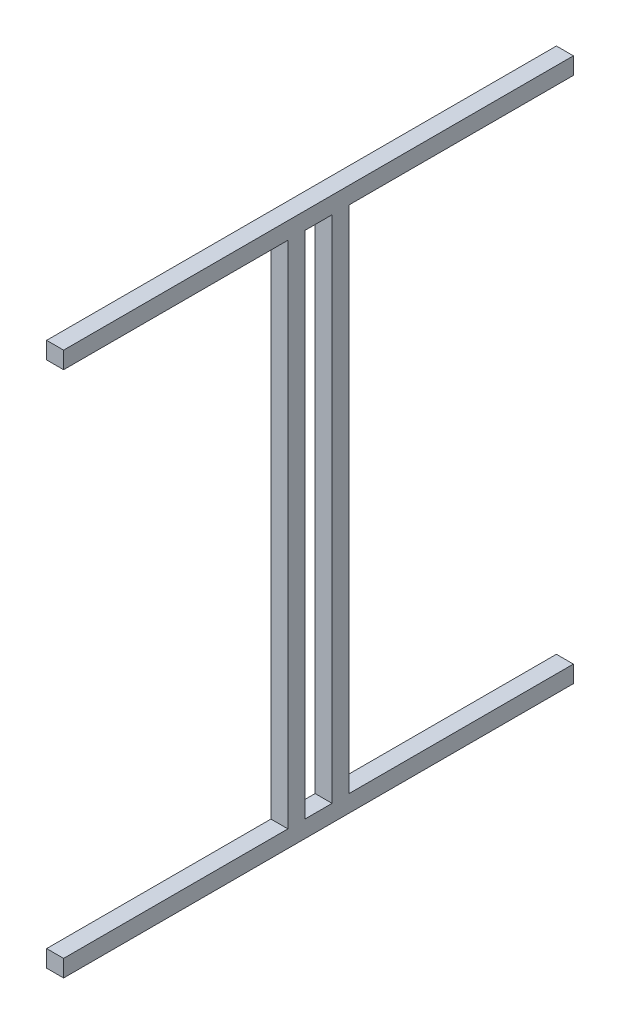
ISO-10303-21;
HEADER;
FILE_DESCRIPTION(('STEP AP214'),'2;1');
FILE_NAME('part.step','',(''),(''),'','','');
FILE_SCHEMA(('AUTOMOTIVE_DESIGN { 1 0 10303 214 1 1 1 1 }'));
ENDSEC;
DATA;
#1=APPLICATION_CONTEXT('core data for automotive mechanical design processes');
#2=APPLICATION_PROTOCOL_DEFINITION('international standard','automotive_design',2000,#1);
#3=PRODUCT_CONTEXT('',#1,'mechanical');
#4=PRODUCT('Part','Part','',(#3));
#5=PRODUCT_RELATED_PRODUCT_CATEGORY('part','',(#4));
#6=PRODUCT_DEFINITION_FORMATION('','',#4);
#7=PRODUCT_DEFINITION_CONTEXT('part definition',#1,'design');
#8=PRODUCT_DEFINITION('design','',#6,#7);
#9=PRODUCT_DEFINITION_SHAPE('','',#8);
#10=(LENGTH_UNIT() NAMED_UNIT(*) SI_UNIT(.MILLI.,.METRE.));
#11=(NAMED_UNIT(*) PLANE_ANGLE_UNIT() SI_UNIT($,.RADIAN.));
#12=(NAMED_UNIT(*) SI_UNIT($,.STERADIAN.) SOLID_ANGLE_UNIT());
#13=UNCERTAINTY_MEASURE_WITH_UNIT(LENGTH_MEASURE(1.E-05),#10,'distance_accuracy_value','');
#14=(GEOMETRIC_REPRESENTATION_CONTEXT(3) GLOBAL_UNCERTAINTY_ASSIGNED_CONTEXT((#13)) GLOBAL_UNIT_ASSIGNED_CONTEXT((#10,
#11,#12)) REPRESENTATION_CONTEXT('',''));
#15=CARTESIAN_POINT('',(0.,0.,0.));
#16=DIRECTION('',(0.,0.,1.));
#17=DIRECTION('',(1.,0.,0.));
#18=AXIS2_PLACEMENT_3D('',#15,#16,#17);
#19=CARTESIAN_POINT('',(20.,0.,0.));
#20=DIRECTION('',(0.,0.,-1.));
#21=DIRECTION('',(-1.,0.,0.));
#22=AXIS2_PLACEMENT_3D('',#19,#20,#21);
#23=PLANE('',#22);
#24=DIRECTION('',(0.,-1.,0.));
#25=VECTOR('',#24,1.);
#26=CARTESIAN_POINT('',(0.,0.,0.));
#27=LINE('',#26,#25);
#28=CARTESIAN_POINT('',(0.,-500.,0.));
#29=VERTEX_POINT('',#28);
#30=CARTESIAN_POINT('',(0.,-520.,0.));
#31=VERTEX_POINT('',#30);
#32=EDGE_CURVE('E265',#29,#31,#27,.T.);
#33=ORIENTED_EDGE('',*,*,#32,.F.);
#34=DIRECTION('',(-1.,0.,0.));
#35=VECTOR('',#34,1.);
#36=CARTESIAN_POINT('',(20.,-500.,0.));
#37=LINE('',#36,#35);
#38=CARTESIAN_POINT('',(20.,-500.,0.));
#39=VERTEX_POINT('',#38);
#40=EDGE_CURVE('E93',#39,#29,#37,.T.);
#41=ORIENTED_EDGE('',*,*,#40,.F.);
#42=DIRECTION('',(0.,-1.,0.));
#43=VECTOR('',#42,1.);
#44=CARTESIAN_POINT('',(20.,0.,0.));
#45=LINE('',#44,#43);
#46=CARTESIAN_POINT('',(20.,-520.,0.));
#47=VERTEX_POINT('',#46);
#48=EDGE_CURVE('E286',#39,#47,#45,.T.);
#49=ORIENTED_EDGE('',*,*,#48,.T.);
#50=DIRECTION('',(-1.,0.,0.));
#51=VECTOR('',#50,1.);
#52=CARTESIAN_POINT('',(20.,-520.,0.));
#53=LINE('',#52,#51);
#54=EDGE_CURVE('E12',#47,#31,#53,.T.);
#55=ORIENTED_EDGE('',*,*,#54,.T.);
#56=EDGE_LOOP('',(#33,#41,#49,#55));
#57=FACE_BOUND('',#56,.T.);
#58=ADVANCED_FACE('F83',(#57),#23,.T.);
#59=CARTESIAN_POINT('',(20.,-500.,0.));
#60=DIRECTION('',(0.,-1.,0.));
#61=DIRECTION('',(0.,0.,-1.));
#62=AXIS2_PLACEMENT_3D('',#59,#60,#61);
#63=PLANE('',#62);
#64=DIRECTION('',(0.,0.,1.));
#65=VECTOR('',#64,1.);
#66=CARTESIAN_POINT('',(0.,-500.,0.));
#67=LINE('',#66,#65);
#68=CARTESIAN_POINT('',(0.,-500.,600.));
#69=VERTEX_POINT('',#68);
#70=EDGE_CURVE('E263',#29,#69,#67,.T.);
#71=ORIENTED_EDGE('',*,*,#70,.T.);
#72=DIRECTION('',(-1.,0.,0.));
#73=VECTOR('',#72,1.);
#74=CARTESIAN_POINT('',(20.,-500.,600.));
#75=LINE('',#74,#73);
#76=CARTESIAN_POINT('',(20.,-500.,600.));
#77=VERTEX_POINT('',#76);
#78=EDGE_CURVE('E226',#77,#69,#75,.T.);
#79=ORIENTED_EDGE('',*,*,#78,.F.);
#80=DIRECTION('',(0.,0.,1.));
#81=VECTOR('',#80,1.);
#82=CARTESIAN_POINT('',(20.,-500.,0.));
#83=LINE('',#82,#81);
#84=EDGE_CURVE('E283',#39,#77,#83,.T.);
#85=ORIENTED_EDGE('',*,*,#84,.F.);
#86=ORIENTED_EDGE('',*,*,#40,.T.);
#87=EDGE_LOOP('',(#71,#79,#85,#86));
#88=FACE_BOUND('',#87,.T.);
#89=ADVANCED_FACE('F353',(#88),#63,.F.);
#90=CARTESIAN_POINT('',(20.,0.,600.));
#91=DIRECTION('',(0.,0.,-1.));
#92=DIRECTION('',(-1.,0.,0.));
#93=AXIS2_PLACEMENT_3D('',#90,#91,#92);
#94=PLANE('',#93);
#95=DIRECTION('',(0.,-1.,0.));
#96=VECTOR('',#95,1.);
#97=CARTESIAN_POINT('',(0.,0.,600.));
#98=LINE('',#97,#96);
#99=CARTESIAN_POINT('',(0.,-520.,600.));
#100=VERTEX_POINT('',#99);
#101=EDGE_CURVE('E260',#69,#100,#98,.T.);
#102=ORIENTED_EDGE('',*,*,#101,.T.);
#103=DIRECTION('',(-1.,0.,0.));
#104=VECTOR('',#103,1.);
#105=CARTESIAN_POINT('',(20.,-520.,600.));
#106=LINE('',#105,#104);
#107=CARTESIAN_POINT('',(20.,-520.,600.));
#108=VERTEX_POINT('',#107);
#109=EDGE_CURVE('E229',#108,#100,#106,.T.);
#110=ORIENTED_EDGE('',*,*,#109,.F.);
#111=DIRECTION('',(0.,-1.,0.));
#112=VECTOR('',#111,1.);
#113=CARTESIAN_POINT('',(20.,0.,600.));
#114=LINE('',#113,#112);
#115=EDGE_CURVE('E280',#77,#108,#114,.T.);
#116=ORIENTED_EDGE('',*,*,#115,.F.);
#117=ORIENTED_EDGE('',*,*,#78,.T.);
#118=EDGE_LOOP('',(#102,#110,#116,#117));
#119=FACE_BOUND('',#118,.T.);
#120=ADVANCED_FACE('F359',(#119),#94,.F.);
#121=CARTESIAN_POINT('',(20.,-520.,0.));
#122=DIRECTION('',(0.,-1.,0.));
#123=DIRECTION('',(0.,0.,-1.));
#124=AXIS2_PLACEMENT_3D('',#121,#122,#123);
#125=PLANE('',#124);
#126=DIRECTION('',(0.,0.,1.));
#127=VECTOR('',#126,1.);
#128=CARTESIAN_POINT('',(0.,-520.,0.));
#129=LINE('',#128,#127);
#130=CARTESIAN_POINT('',(0.,-520.,336.));
#131=VERTEX_POINT('',#130);
#132=EDGE_CURVE('E259',#131,#100,#129,.T.);
#133=ORIENTED_EDGE('',*,*,#132,.F.);
#134=DIRECTION('',(-1.,0.,0.));
#135=VECTOR('',#134,1.);
#136=CARTESIAN_POINT('',(20.,-520.,336.));
#137=LINE('',#136,#135);
#138=CARTESIAN_POINT('',(20.,-520.,336.));
#139=VERTEX_POINT('',#138);
#140=EDGE_CURVE('E231',#139,#131,#137,.T.);
#141=ORIENTED_EDGE('',*,*,#140,.F.);
#142=DIRECTION('',(0.,0.,1.));
#143=VECTOR('',#142,1.);
#144=CARTESIAN_POINT('',(20.,-520.,0.));
#145=LINE('',#144,#143);
#146=EDGE_CURVE('E279',#139,#108,#145,.T.);
#147=ORIENTED_EDGE('',*,*,#146,.T.);
#148=ORIENTED_EDGE('',*,*,#109,.T.);
#149=EDGE_LOOP('',(#133,#141,#147,#148));
#150=FACE_BOUND('',#149,.T.);
#151=ADVANCED_FACE('F299',(#150),#125,.T.);
#152=CARTESIAN_POINT('',(20.,0.,336.));
#153=DIRECTION('',(0.,0.,-1.));
#154=DIRECTION('',(0.,1.,0.));
#155=AXIS2_PLACEMENT_3D('',#152,#153,#154);
#156=PLANE('',#155);
#157=DIRECTION('',(0.,-1.,0.));
#158=VECTOR('',#157,1.);
#159=CARTESIAN_POINT('',(0.,0.,336.));
#160=LINE('',#159,#158);
#161=CARTESIAN_POINT('',(0.,-1120.,336.));
#162=VERTEX_POINT('',#161);
#163=EDGE_CURVE('E256',#131,#162,#160,.T.);
#164=ORIENTED_EDGE('',*,*,#163,.T.);
#165=DIRECTION('',(-1.,0.,0.));
#166=VECTOR('',#165,1.);
#167=CARTESIAN_POINT('',(20.,-1120.,336.));
#168=LINE('',#167,#166);
#169=CARTESIAN_POINT('',(20.,-1120.,336.));
#170=VERTEX_POINT('',#169);
#171=EDGE_CURVE('E233',#170,#162,#168,.T.);
#172=ORIENTED_EDGE('',*,*,#171,.F.);
#173=DIRECTION('',(0.,-1.,0.));
#174=VECTOR('',#173,1.);
#175=CARTESIAN_POINT('',(20.,0.,336.));
#176=LINE('',#175,#174);
#177=EDGE_CURVE('E277',#139,#170,#176,.T.);
#178=ORIENTED_EDGE('',*,*,#177,.F.);
#179=ORIENTED_EDGE('',*,*,#140,.T.);
#180=EDGE_LOOP('',(#164,#172,#178,#179));
#181=FACE_BOUND('',#180,.T.);
#182=ADVANCED_FACE('F342',(#181),#156,.F.);
#183=CARTESIAN_POINT('',(20.,0.,316.));
#184=DIRECTION('',(0.,0.,-1.));
#185=DIRECTION('',(-1.,0.,0.));
#186=AXIS2_PLACEMENT_3D('',#183,#184,#185);
#187=PLANE('',#186);
#188=DIRECTION('',(0.,-1.,0.));
#189=VECTOR('',#188,1.);
#190=CARTESIAN_POINT('',(0.,0.,316.));
#191=LINE('',#190,#189);
#192=CARTESIAN_POINT('',(0.,-520.,316.));
#193=VERTEX_POINT('',#192);
#194=CARTESIAN_POINT('',(0.,-1120.,316.));
#195=VERTEX_POINT('',#194);
#196=EDGE_CURVE('E253',#193,#195,#191,.T.);
#197=ORIENTED_EDGE('',*,*,#196,.F.);
#198=DIRECTION('',(-1.,0.,0.));
#199=VECTOR('',#198,1.);
#200=CARTESIAN_POINT('',(20.,-520.,316.));
#201=LINE('',#200,#199);
#202=CARTESIAN_POINT('',(20.,-520.,316.));
#203=VERTEX_POINT('',#202);
#204=EDGE_CURVE('E237',#203,#193,#201,.T.);
#205=ORIENTED_EDGE('',*,*,#204,.F.);
#206=DIRECTION('',(0.,-1.,0.));
#207=VECTOR('',#206,1.);
#208=CARTESIAN_POINT('',(20.,0.,316.));
#209=LINE('',#208,#207);
#210=CARTESIAN_POINT('',(20.,-1120.,316.));
#211=VERTEX_POINT('',#210);
#212=EDGE_CURVE('E274',#203,#211,#209,.T.);
#213=ORIENTED_EDGE('',*,*,#212,.T.);
#214=DIRECTION('',(-1.,0.,0.));
#215=VECTOR('',#214,1.);
#216=CARTESIAN_POINT('',(20.,-1120.,316.));
#217=LINE('',#216,#215);
#218=EDGE_CURVE('E235',#211,#195,#217,.T.);
#219=ORIENTED_EDGE('',*,*,#218,.T.);
#220=EDGE_LOOP('',(#197,#205,#213,#219));
#221=FACE_BOUND('',#220,.T.);
#222=ADVANCED_FACE('F340',(#221),#187,.T.);
#223=CARTESIAN_POINT('',(0.,-520.,284.));
#224=VERTEX_POINT('',#223);
#225=EDGE_CURVE('E252',#224,#193,#129,.T.);
#226=ORIENTED_EDGE('',*,*,#225,.F.);
#227=DIRECTION('',(-1.,0.,0.));
#228=VECTOR('',#227,1.);
#229=CARTESIAN_POINT('',(20.,-520.,284.));
#230=LINE('',#229,#228);
#231=CARTESIAN_POINT('',(20.,-520.,284.));
#232=VERTEX_POINT('',#231);
#233=EDGE_CURVE('E239',#232,#224,#230,.T.);
#234=ORIENTED_EDGE('',*,*,#233,.F.);
#235=EDGE_CURVE('E273',#232,#203,#145,.T.);
#236=ORIENTED_EDGE('',*,*,#235,.T.);
#237=ORIENTED_EDGE('',*,*,#204,.T.);
#238=EDGE_LOOP('',(#226,#234,#236,#237));
#239=FACE_BOUND('',#238,.T.);
#240=ADVANCED_FACE('F336',(#239),#125,.T.);
#241=CARTESIAN_POINT('',(20.,0.,284.));
#242=DIRECTION('',(0.,0.,-1.));
#243=DIRECTION('',(-1.,0.,0.));
#244=AXIS2_PLACEMENT_3D('',#241,#242,#243);
#245=PLANE('',#244);
#246=DIRECTION('',(0.,-1.,0.));
#247=VECTOR('',#246,1.);
#248=CARTESIAN_POINT('',(0.,0.,284.));
#249=LINE('',#248,#247);
#250=CARTESIAN_POINT('',(0.,-1120.,284.));
#251=VERTEX_POINT('',#250);
#252=EDGE_CURVE('E249',#224,#251,#249,.T.);
#253=ORIENTED_EDGE('',*,*,#252,.T.);
#254=DIRECTION('',(-1.,0.,0.));
#255=VECTOR('',#254,1.);
#256=CARTESIAN_POINT('',(20.,-1120.,284.));
#257=LINE('',#256,#255);
#258=CARTESIAN_POINT('',(20.,-1120.,284.));
#259=VERTEX_POINT('',#258);
#260=EDGE_CURVE('E241',#259,#251,#257,.T.);
#261=ORIENTED_EDGE('',*,*,#260,.F.);
#262=DIRECTION('',(0.,-1.,0.));
#263=VECTOR('',#262,1.);
#264=CARTESIAN_POINT('',(20.,0.,284.));
#265=LINE('',#264,#263);
#266=EDGE_CURVE('E270',#232,#259,#265,.T.);
#267=ORIENTED_EDGE('',*,*,#266,.F.);
#268=ORIENTED_EDGE('',*,*,#233,.T.);
#269=EDGE_LOOP('',(#253,#261,#267,#268));
#270=FACE_BOUND('',#269,.T.);
#271=ADVANCED_FACE('F326',(#270),#245,.F.);
#272=CARTESIAN_POINT('',(20.,0.,264.));
#273=DIRECTION('',(0.,0.,-1.));
#274=DIRECTION('',(0.,1.,0.));
#275=AXIS2_PLACEMENT_3D('',#272,#273,#274);
#276=PLANE('',#275);
#277=DIRECTION('',(0.,-1.,0.));
#278=VECTOR('',#277,1.);
#279=CARTESIAN_POINT('',(0.,0.,264.));
#280=LINE('',#279,#278);
#281=CARTESIAN_POINT('',(0.,-520.,264.));
#282=VERTEX_POINT('',#281);
#283=CARTESIAN_POINT('',(0.,-1120.,264.));
#284=VERTEX_POINT('',#283);
#285=EDGE_CURVE('E193',#282,#284,#280,.T.);
#286=ORIENTED_EDGE('',*,*,#285,.F.);
#287=DIRECTION('',(-1.,0.,0.));
#288=VECTOR('',#287,1.);
#289=CARTESIAN_POINT('',(20.,-520.,264.));
#290=LINE('',#289,#288);
#291=CARTESIAN_POINT('',(20.,-520.,264.));
#292=VERTEX_POINT('',#291);
#293=EDGE_CURVE('E102',#292,#282,#290,.T.);
#294=ORIENTED_EDGE('',*,*,#293,.F.);
#295=DIRECTION('',(0.,-1.,0.));
#296=VECTOR('',#295,1.);
#297=CARTESIAN_POINT('',(20.,0.,264.));
#298=LINE('',#297,#296);
#299=CARTESIAN_POINT('',(20.,-1120.,264.));
#300=VERTEX_POINT('',#299);
#301=EDGE_CURVE('E246',#292,#300,#298,.T.);
#302=ORIENTED_EDGE('',*,*,#301,.T.);
#303=DIRECTION('',(-1.,0.,0.));
#304=VECTOR('',#303,1.);
#305=CARTESIAN_POINT('',(20.,-1120.,264.));
#306=LINE('',#305,#304);
#307=EDGE_CURVE('E243',#300,#284,#306,.T.);
#308=ORIENTED_EDGE('',*,*,#307,.T.);
#309=EDGE_LOOP('',(#286,#294,#302,#308));
#310=FACE_BOUND('',#309,.T.);
#311=ADVANCED_FACE('F390',(#310),#276,.T.);
#312=EDGE_CURVE('E183',#31,#282,#129,.T.);
#313=ORIENTED_EDGE('',*,*,#312,.F.);
#314=ORIENTED_EDGE('',*,*,#54,.F.);
#315=EDGE_CURVE('E248',#47,#292,#145,.T.);
#316=ORIENTED_EDGE('',*,*,#315,.T.);
#317=ORIENTED_EDGE('',*,*,#293,.T.);
#318=EDGE_LOOP('',(#313,#314,#316,#317));
#319=FACE_BOUND('',#318,.T.);
#320=ADVANCED_FACE('F349',(#319),#125,.T.);
#321=CARTESIAN_POINT('',(0.,0.,0.));
#322=DIRECTION('',(1.,0.,0.));
#323=DIRECTION('',(0.,0.,-1.));
#324=AXIS2_PLACEMENT_3D('',#321,#322,#323);
#325=PLANE('',#324);
#326=DIRECTION('',(0.,0.,1.));
#327=VECTOR('',#326,1.);
#328=CARTESIAN_POINT('',(0.,-1120.,-6.54926439620986E-12));
#329=LINE('',#328,#327);
#330=CARTESIAN_POINT('',(0.,-1120.,599.999999999994));
#331=VERTEX_POINT('',#330);
#332=EDGE_CURVE('E166',#162,#331,#329,.T.);
#333=ORIENTED_EDGE('',*,*,#332,.F.);
#334=ORIENTED_EDGE('',*,*,#163,.F.);
#335=ORIENTED_EDGE('',*,*,#132,.T.);
#336=ORIENTED_EDGE('',*,*,#101,.F.);
#337=ORIENTED_EDGE('',*,*,#70,.F.);
#338=ORIENTED_EDGE('',*,*,#32,.T.);
#339=ORIENTED_EDGE('',*,*,#312,.T.);
#340=ORIENTED_EDGE('',*,*,#285,.T.);
#341=CARTESIAN_POINT('',(0.,-1120.,-6.54926439620986E-12));
#342=VERTEX_POINT('',#341);
#343=EDGE_CURVE('E175',#342,#284,#329,.T.);
#344=ORIENTED_EDGE('',*,*,#343,.F.);
#345=DIRECTION('',(0.,-1.,0.));
#346=VECTOR('',#345,1.);
#347=CARTESIAN_POINT('',(0.,-1120.,-6.54926439620986E-12));
#348=LINE('',#347,#346);
#349=CARTESIAN_POINT('',(0.,-1140.,-6.54926439620986E-12));
#350=VERTEX_POINT('',#349);
#351=EDGE_CURVE('E191',#342,#350,#348,.T.);
#352=ORIENTED_EDGE('',*,*,#351,.T.);
#353=DIRECTION('',(0.,0.,1.));
#354=VECTOR('',#353,1.);
#355=CARTESIAN_POINT('',(0.,-1140.,-6.54926439620986E-12));
#356=LINE('',#355,#354);
#357=CARTESIAN_POINT('',(0.,-1140.,599.999999999994));
#358=VERTEX_POINT('',#357);
#359=EDGE_CURVE('E198',#350,#358,#356,.T.);
#360=ORIENTED_EDGE('',*,*,#359,.T.);
#361=DIRECTION('',(0.,-1.,0.));
#362=VECTOR('',#361,1.);
#363=CARTESIAN_POINT('',(0.,-1120.,599.999999999994));
#364=LINE('',#363,#362);
#365=EDGE_CURVE('E200',#331,#358,#364,.T.);
#366=ORIENTED_EDGE('',*,*,#365,.F.);
#367=EDGE_LOOP('',(#333,#334,#335,#336,#337,#338,#339,#340,#344,#352,#360,#366));
#368=FACE_BOUND('',#367,.T.);
#369=ORIENTED_EDGE('',*,*,#196,.T.);
#370=EDGE_CURVE('E195',#251,#195,#329,.T.);
#371=ORIENTED_EDGE('',*,*,#370,.F.);
#372=ORIENTED_EDGE('',*,*,#252,.F.);
#373=ORIENTED_EDGE('',*,*,#225,.T.);
#374=EDGE_LOOP('',(#369,#371,#372,#373));
#375=FACE_BOUND('',#374,.T.);
#376=ADVANCED_FACE('F188',(#368,#375),#325,.F.);
#377=CARTESIAN_POINT('',(20.,0.,0.));
#378=DIRECTION('',(1.,0.,0.));
#379=DIRECTION('',(0.,0.,-1.));
#380=AXIS2_PLACEMENT_3D('',#377,#378,#379);
#381=PLANE('',#380);
#382=ORIENTED_EDGE('',*,*,#177,.T.);
#383=DIRECTION('',(0.,0.,1.));
#384=VECTOR('',#383,1.);
#385=CARTESIAN_POINT('',(20.,-1120.,-6.54926439620986E-12));
#386=LINE('',#385,#384);
#387=CARTESIAN_POINT('',(20.,-1120.,599.999999999994));
#388=VERTEX_POINT('',#387);
#389=EDGE_CURVE('E212',#170,#388,#386,.T.);
#390=ORIENTED_EDGE('',*,*,#389,.T.);
#391=DIRECTION('',(0.,-1.,0.));
#392=VECTOR('',#391,1.);
#393=CARTESIAN_POINT('',(20.,-1120.,599.999999999994));
#394=LINE('',#393,#392);
#395=CARTESIAN_POINT('',(20.,-1140.,599.999999999994));
#396=VERTEX_POINT('',#395);
#397=EDGE_CURVE('E216',#388,#396,#394,.T.);
#398=ORIENTED_EDGE('',*,*,#397,.T.);
#399=DIRECTION('',(0.,0.,1.));
#400=VECTOR('',#399,1.);
#401=CARTESIAN_POINT('',(20.,-1140.,-6.54926439620986E-12));
#402=LINE('',#401,#400);
#403=CARTESIAN_POINT('',(20.,-1140.,-6.54926439620986E-12));
#404=VERTEX_POINT('',#403);
#405=EDGE_CURVE('E219',#404,#396,#402,.T.);
#406=ORIENTED_EDGE('',*,*,#405,.F.);
#407=DIRECTION('',(0.,-1.,0.));
#408=VECTOR('',#407,1.);
#409=CARTESIAN_POINT('',(20.,-1120.,-6.54926439620986E-12));
#410=LINE('',#409,#408);
#411=CARTESIAN_POINT('',(20.,-1120.,-6.54926439620986E-12));
#412=VERTEX_POINT('',#411);
#413=EDGE_CURVE('E194',#412,#404,#410,.T.);
#414=ORIENTED_EDGE('',*,*,#413,.F.);
#415=EDGE_CURVE('E178',#412,#300,#386,.T.);
#416=ORIENTED_EDGE('',*,*,#415,.T.);
#417=ORIENTED_EDGE('',*,*,#301,.F.);
#418=ORIENTED_EDGE('',*,*,#315,.F.);
#419=ORIENTED_EDGE('',*,*,#48,.F.);
#420=ORIENTED_EDGE('',*,*,#84,.T.);
#421=ORIENTED_EDGE('',*,*,#115,.T.);
#422=ORIENTED_EDGE('',*,*,#146,.F.);
#423=EDGE_LOOP('',(#382,#390,#398,#406,#414,#416,#417,#418,#419,#420,#421,#422));
#424=FACE_BOUND('',#423,.T.);
#425=EDGE_CURVE('E211',#259,#211,#386,.T.);
#426=ORIENTED_EDGE('',*,*,#425,.T.);
#427=ORIENTED_EDGE('',*,*,#212,.F.);
#428=ORIENTED_EDGE('',*,*,#235,.F.);
#429=ORIENTED_EDGE('',*,*,#266,.T.);
#430=EDGE_LOOP('',(#426,#427,#428,#429));
#431=FACE_BOUND('',#430,.T.);
#432=ADVANCED_FACE('F305',(#424,#431),#381,.T.);
#433=CARTESIAN_POINT('',(20.,-1120.,-6.54926439620986E-12));
#434=DIRECTION('',(0.,-1.,0.));
#435=DIRECTION('',(0.,0.,-1.));
#436=AXIS2_PLACEMENT_3D('',#433,#434,#435);
#437=PLANE('',#436);
#438=ORIENTED_EDGE('',*,*,#307,.F.);
#439=ORIENTED_EDGE('',*,*,#415,.F.);
#440=DIRECTION('',(-1.,0.,0.));
#441=VECTOR('',#440,1.);
#442=CARTESIAN_POINT('',(20.,-1120.,-6.54926439620986E-12));
#443=LINE('',#442,#441);
#444=EDGE_CURVE('E172',#412,#342,#443,.T.);
#445=ORIENTED_EDGE('',*,*,#444,.T.);
#446=ORIENTED_EDGE('',*,*,#343,.T.);
#447=EDGE_LOOP('',(#438,#439,#445,#446));
#448=FACE_BOUND('',#447,.T.);
#449=ADVANCED_FACE('F174',(#448),#437,.F.);
#450=ORIENTED_EDGE('',*,*,#218,.F.);
#451=ORIENTED_EDGE('',*,*,#425,.F.);
#452=ORIENTED_EDGE('',*,*,#260,.T.);
#453=ORIENTED_EDGE('',*,*,#370,.T.);
#454=EDGE_LOOP('',(#450,#451,#452,#453));
#455=FACE_BOUND('',#454,.T.);
#456=ADVANCED_FACE('F332',(#455),#437,.F.);
#457=ORIENTED_EDGE('',*,*,#389,.F.);
#458=ORIENTED_EDGE('',*,*,#171,.T.);
#459=ORIENTED_EDGE('',*,*,#332,.T.);
#460=DIRECTION('',(-1.,0.,0.));
#461=VECTOR('',#460,1.);
#462=CARTESIAN_POINT('',(20.,-1120.,599.999999999994));
#463=LINE('',#462,#461);
#464=EDGE_CURVE('E184',#388,#331,#463,.T.);
#465=ORIENTED_EDGE('',*,*,#464,.F.);
#466=EDGE_LOOP('',(#457,#458,#459,#465));
#467=FACE_BOUND('',#466,.T.);
#468=ADVANCED_FACE('F367',(#467),#437,.F.);
#469=CARTESIAN_POINT('',(20.,-1120.,599.999999999994));
#470=DIRECTION('',(0.,0.,-1.));
#471=DIRECTION('',(-1.,0.,0.));
#472=AXIS2_PLACEMENT_3D('',#469,#470,#471);
#473=PLANE('',#472);
#474=ORIENTED_EDGE('',*,*,#365,.T.);
#475=DIRECTION('',(-1.,0.,0.));
#476=VECTOR('',#475,1.);
#477=CARTESIAN_POINT('',(20.,-1140.,599.999999999994));
#478=LINE('',#477,#476);
#479=EDGE_CURVE('E207',#396,#358,#478,.T.);
#480=ORIENTED_EDGE('',*,*,#479,.F.);
#481=ORIENTED_EDGE('',*,*,#397,.F.);
#482=ORIENTED_EDGE('',*,*,#464,.T.);
#483=EDGE_LOOP('',(#474,#480,#481,#482));
#484=FACE_BOUND('',#483,.T.);
#485=ADVANCED_FACE('F368',(#484),#473,.F.);
#486=CARTESIAN_POINT('',(20.,-1140.,-6.54926439620986E-12));
#487=DIRECTION('',(0.,-1.,0.));
#488=DIRECTION('',(0.,0.,-1.));
#489=AXIS2_PLACEMENT_3D('',#486,#487,#488);
#490=PLANE('',#489);
#491=ORIENTED_EDGE('',*,*,#359,.F.);
#492=DIRECTION('',(-1.,0.,0.));
#493=VECTOR('',#492,1.);
#494=CARTESIAN_POINT('',(20.,-1140.,-6.54926439620986E-12));
#495=LINE('',#494,#493);
#496=EDGE_CURVE('E87',#404,#350,#495,.T.);
#497=ORIENTED_EDGE('',*,*,#496,.F.);
#498=ORIENTED_EDGE('',*,*,#405,.T.);
#499=ORIENTED_EDGE('',*,*,#479,.T.);
#500=EDGE_LOOP('',(#491,#497,#498,#499));
#501=FACE_BOUND('',#500,.T.);
#502=ADVANCED_FACE('F370',(#501),#490,.T.);
#503=CARTESIAN_POINT('',(20.,-1120.,-6.54926439620986E-12));
#504=DIRECTION('',(0.,0.,-1.));
#505=DIRECTION('',(-1.,0.,0.));
#506=AXIS2_PLACEMENT_3D('',#503,#504,#505);
#507=PLANE('',#506);
#508=ORIENTED_EDGE('',*,*,#351,.F.);
#509=ORIENTED_EDGE('',*,*,#444,.F.);
#510=ORIENTED_EDGE('',*,*,#413,.T.);
#511=ORIENTED_EDGE('',*,*,#496,.T.);
#512=EDGE_LOOP('',(#508,#509,#510,#511));
#513=FACE_BOUND('',#512,.T.);
#514=ADVANCED_FACE('F85',(#513),#507,.T.);
#515=CLOSED_SHELL('',(#58,#89,#120,#151,#182,#222,#240,#271,#311,#320,#376,#432,#449,#456,#468,
#485,#502,#514));
#516=MANIFOLD_SOLID_BREP('B2',#515);
#517=ADVANCED_BREP_SHAPE_REPRESENTATION('',(#18,#516),#14);
#518=SHAPE_DEFINITION_REPRESENTATION(#9,#517);
ENDSEC;
END-ISO-10303-21;
